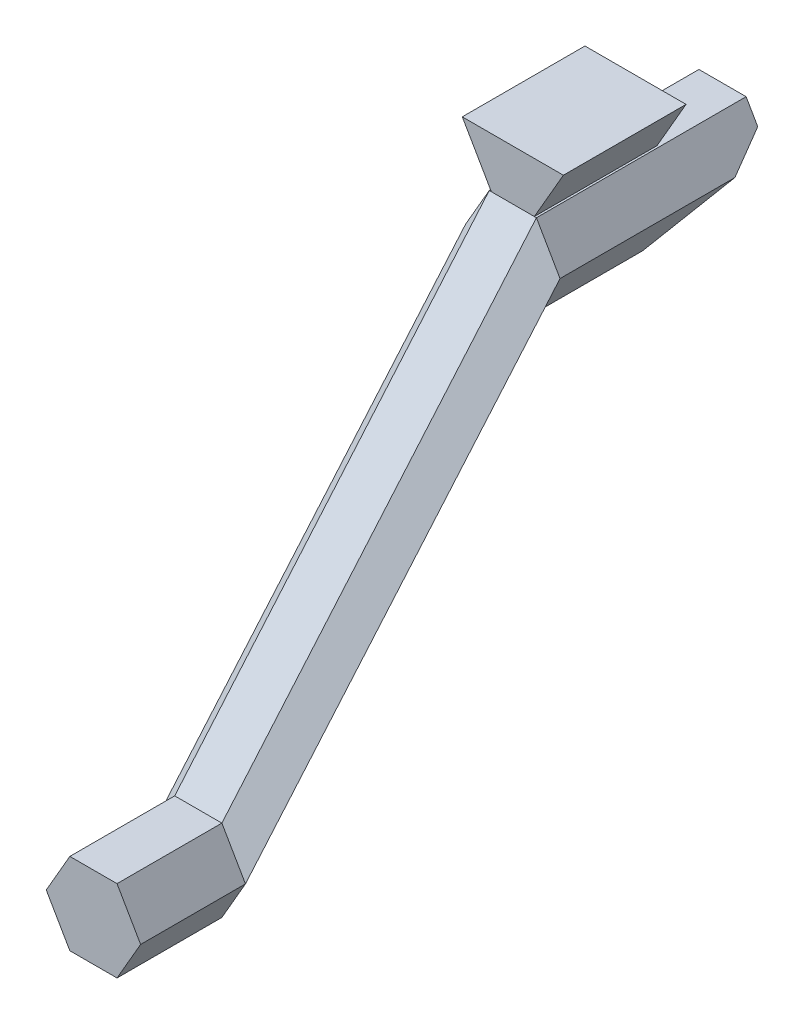
ISO-10303-21;
HEADER;
FILE_DESCRIPTION(('STEP AP214'),'2;1');
FILE_NAME('part.step','',(''),(''),'','','');
FILE_SCHEMA(('AUTOMOTIVE_DESIGN { 1 0 10303 214 1 1 1 1 }'));
ENDSEC;
DATA;
#1=APPLICATION_CONTEXT('core data for automotive mechanical design processes');
#2=APPLICATION_PROTOCOL_DEFINITION('international standard','automotive_design',2000,#1);
#3=PRODUCT_CONTEXT('',#1,'mechanical');
#4=PRODUCT('Part','Part','',(#3));
#5=PRODUCT_RELATED_PRODUCT_CATEGORY('part','',(#4));
#6=PRODUCT_DEFINITION_FORMATION('','',#4);
#7=PRODUCT_DEFINITION_CONTEXT('part definition',#1,'design');
#8=PRODUCT_DEFINITION('design','',#6,#7);
#9=PRODUCT_DEFINITION_SHAPE('','',#8);
#10=(LENGTH_UNIT() NAMED_UNIT(*) SI_UNIT(.MILLI.,.METRE.));
#11=(NAMED_UNIT(*) PLANE_ANGLE_UNIT() SI_UNIT($,.RADIAN.));
#12=(NAMED_UNIT(*) SI_UNIT($,.STERADIAN.) SOLID_ANGLE_UNIT());
#13=UNCERTAINTY_MEASURE_WITH_UNIT(LENGTH_MEASURE(1.E-05),#10,'distance_accuracy_value','');
#14=(GEOMETRIC_REPRESENTATION_CONTEXT(3) GLOBAL_UNCERTAINTY_ASSIGNED_CONTEXT((#13)) GLOBAL_UNIT_ASSIGNED_CONTEXT((#10,
#11,#12)) REPRESENTATION_CONTEXT('',''));
#15=CARTESIAN_POINT('',(0.,0.,0.));
#16=DIRECTION('',(0.,0.,1.));
#17=DIRECTION('',(1.,0.,0.));
#18=AXIS2_PLACEMENT_3D('',#15,#16,#17);
#19=CARTESIAN_POINT('',(2.85750000000006,-4.94933518262803,25.4));
#20=DIRECTION('',(-0.866025403784442,0.499999999999995,0.));
#21=DIRECTION('',(-0.499999999999995,-0.866025403784442,0.));
#22=AXIS2_PLACEMENT_3D('',#19,#20,#21);
#23=PLANE('',#22);
#24=DIRECTION('',(0.,0.,-1.));
#25=VECTOR('',#24,1.);
#26=CARTESIAN_POINT('',(2.85750000000006,-4.94933518262803,25.4));
#27=LINE('',#26,#25);
#28=CARTESIAN_POINT('',(2.85750000000002,-4.94933518262805,25.4));
#29=VERTEX_POINT('',#28);
#30=CARTESIAN_POINT('',(2.85750000000006,-4.94933518262803,12.5400000000001));
#31=VERTEX_POINT('',#30);
#32=EDGE_CURVE('E427',#29,#31,#27,.T.);
#33=ORIENTED_EDGE('',*,*,#32,.T.);
#34=DIRECTION('',(-0.283104064772028,-0.490350624014429,0.824262309000124));
#35=VECTOR('',#34,1.);
#36=CARTESIAN_POINT('',(2.39945468583216,-5.74269293893569,13.8736067378148));
#37=LINE('',#36,#35);
#38=CARTESIAN_POINT('',(5.715,0.,4.22034005493904));
#39=VERTEX_POINT('',#38);
#40=EDGE_CURVE('E338',#31,#39,#37,.F.);
#41=ORIENTED_EDGE('',*,*,#40,.T.);
#42=DIRECTION('',(0.,0.,-1.));
#43=VECTOR('',#42,1.);
#44=CARTESIAN_POINT('',(5.715,0.,25.4));
#45=LINE('',#44,#43);
#46=CARTESIAN_POINT('',(5.71499999999998,0.,25.4));
#47=VERTEX_POINT('',#46);
#48=EDGE_CURVE('E339',#47,#39,#45,.T.);
#49=ORIENTED_EDGE('',*,*,#48,.F.);
#50=DIRECTION('',(0.500000000000003,0.866025403784437,0.));
#51=VECTOR('',#50,1.);
#52=CARTESIAN_POINT('',(2.85750000000002,-4.94933518262801,25.4));
#53=LINE('',#52,#51);
#54=EDGE_CURVE('E434',#29,#47,#53,.T.);
#55=ORIENTED_EDGE('',*,*,#54,.F.);
#56=EDGE_LOOP('',(#33,#41,#49,#55));
#57=FACE_BOUND('',#56,.T.);
#58=ADVANCED_FACE('F48',(#57),#23,.F.);
#59=CARTESIAN_POINT('',(5.715,0.,25.4));
#60=DIRECTION('',(-0.866025403784438,-0.500000000000001,0.));
#61=DIRECTION('',(0.500000000000001,-0.866025403784438,0.));
#62=AXIS2_PLACEMENT_3D('',#59,#60,#61);
#63=PLANE('',#62);
#64=ORIENTED_EDGE('',*,*,#48,.T.);
#65=DIRECTION('',(0.28310406477203,-0.490350624014424,0.824262309000126));
#66=VECTOR('',#65,1.);
#67=CARTESIAN_POINT('',(7.65640937166418,-3.36261967001273,9.87278652437067));
#68=LINE('',#67,#66);
#69=CARTESIAN_POINT('',(4.26546699184535,2.51066481737201,0.));
#70=VERTEX_POINT('',#69);
#71=EDGE_CURVE('E341',#39,#70,#68,.F.);
#72=ORIENTED_EDGE('',*,*,#71,.T.);
#73=DIRECTION('',(-0.500000000000001,0.866025403784438,0.));
#74=VECTOR('',#73,1.);
#75=CARTESIAN_POINT('',(5.715,0.,0.));
#76=LINE('',#75,#74);
#77=CARTESIAN_POINT('',(2.85749999999999,4.94933518262807,0.));
#78=VERTEX_POINT('',#77);
#79=EDGE_CURVE('E311',#70,#78,#76,.T.);
#80=ORIENTED_EDGE('',*,*,#79,.T.);
#81=DIRECTION('',(0.,0.,-1.));
#82=VECTOR('',#81,1.);
#83=CARTESIAN_POINT('',(2.85749999999999,4.94933518262807,25.4));
#84=LINE('',#83,#82);
#85=CARTESIAN_POINT('',(2.85749999999999,4.94933518262807,25.4));
#86=VERTEX_POINT('',#85);
#87=EDGE_CURVE('E425',#86,#78,#84,.T.);
#88=ORIENTED_EDGE('',*,*,#87,.F.);
#89=DIRECTION('',(-0.499999999999991,0.866025403784444,0.));
#90=VECTOR('',#89,1.);
#91=CARTESIAN_POINT('',(5.71499999999994,0.,25.4));
#92=LINE('',#91,#90);
#93=EDGE_CURVE('E437',#47,#86,#92,.T.);
#94=ORIENTED_EDGE('',*,*,#93,.F.);
#95=EDGE_LOOP('',(#64,#72,#80,#88,#94));
#96=FACE_BOUND('',#95,.T.);
#97=ADVANCED_FACE('F383',(#96),#63,.F.);
#98=CARTESIAN_POINT('',(-2.85750000000002,4.94933518262805,25.4));
#99=DIRECTION('',(0.866025403784441,-0.499999999999995,0.));
#100=DIRECTION('',(0.499999999999995,0.866025403784441,0.));
#101=AXIS2_PLACEMENT_3D('',#98,#99,#100);
#102=PLANE('',#101);
#103=DIRECTION('',(-0.499999999999995,-0.866025403784441,0.));
#104=VECTOR('',#103,1.);
#105=CARTESIAN_POINT('',(-2.85750000000002,4.94933518262805,0.));
#106=LINE('',#105,#104);
#107=CARTESIAN_POINT('',(-2.85750000000002,4.94933518262805,0.));
#108=VERTEX_POINT('',#107);
#109=CARTESIAN_POINT('',(-4.2654669918454,2.51066481737192,0.));
#110=VERTEX_POINT('',#109);
#111=EDGE_CURVE('E415',#108,#110,#106,.T.);
#112=ORIENTED_EDGE('',*,*,#111,.T.);
#113=DIRECTION('',(0.283104064772028,0.490350624014429,-0.824262309000124));
#114=VECTOR('',#113,1.);
#115=CARTESIAN_POINT('',(-8.11445468583209,-4.15597742632049,11.2063932621853));
#116=LINE('',#115,#114);
#117=CARTESIAN_POINT('',(-5.715,0.,4.2203400549389));
#118=VERTEX_POINT('',#117);
#119=EDGE_CURVE('E345',#110,#118,#116,.F.);
#120=ORIENTED_EDGE('',*,*,#119,.T.);
#121=DIRECTION('',(0.,0.,-1.));
#122=VECTOR('',#121,1.);
#123=CARTESIAN_POINT('',(-5.715,0.,25.4));
#124=LINE('',#123,#122);
#125=CARTESIAN_POINT('',(-5.715,0.,25.4));
#126=VERTEX_POINT('',#125);
#127=EDGE_CURVE('E412',#126,#118,#124,.T.);
#128=ORIENTED_EDGE('',*,*,#127,.F.);
#129=DIRECTION('',(-0.499999999999995,-0.866025403784441,0.));
#130=VECTOR('',#129,1.);
#131=CARTESIAN_POINT('',(-2.85750000000002,4.94933518262805,25.4));
#132=LINE('',#131,#130);
#133=CARTESIAN_POINT('',(-2.85750000000002,4.94933518262805,25.4));
#134=VERTEX_POINT('',#133);
#135=EDGE_CURVE('E442',#134,#126,#132,.T.);
#136=ORIENTED_EDGE('',*,*,#135,.F.);
#137=DIRECTION('',(0.,0.,-1.));
#138=VECTOR('',#137,1.);
#139=CARTESIAN_POINT('',(-2.85750000000002,4.94933518262805,25.4));
#140=LINE('',#139,#138);
#141=EDGE_CURVE('E422',#134,#108,#140,.T.);
#142=ORIENTED_EDGE('',*,*,#141,.T.);
#143=EDGE_LOOP('',(#112,#120,#128,#136,#142));
#144=FACE_BOUND('',#143,.T.);
#145=ADVANCED_FACE('F389',(#144),#102,.F.);
#146=CARTESIAN_POINT('',(-5.715,0.,25.4));
#147=DIRECTION('',(0.866025403784434,0.500000000000007,0.));
#148=DIRECTION('',(-0.500000000000007,0.866025403784435,0.));
#149=AXIS2_PLACEMENT_3D('',#146,#147,#148);
#150=PLANE('',#149);
#151=ORIENTED_EDGE('',*,*,#127,.T.);
#152=DIRECTION('',(-0.283104064772034,0.490350624014424,-0.824262309000125));
#153=VECTOR('',#152,1.);
#154=CARTESIAN_POINT('',(-2.85749999999995,-4.94933518262809,12.5400000000001));
#155=LINE('',#154,#153);
#156=CARTESIAN_POINT('',(-2.85749999999995,-4.94933518262809,12.5400000000001));
#157=VERTEX_POINT('',#156);
#158=EDGE_CURVE('E347',#118,#157,#155,.F.);
#159=ORIENTED_EDGE('',*,*,#158,.T.);
#160=DIRECTION('',(0.,0.,-1.));
#161=VECTOR('',#160,1.);
#162=CARTESIAN_POINT('',(-2.85749999999995,-4.94933518262809,25.4));
#163=LINE('',#162,#161);
#164=CARTESIAN_POINT('',(-2.85749999999995,-4.94933518262809,25.4));
#165=VERTEX_POINT('',#164);
#166=EDGE_CURVE('E423',#165,#157,#163,.T.);
#167=ORIENTED_EDGE('',*,*,#166,.F.);
#168=DIRECTION('',(0.500000000000007,-0.866025403784435,0.));
#169=VECTOR('',#168,1.);
#170=CARTESIAN_POINT('',(-5.715,0.,25.4));
#171=LINE('',#170,#169);
#172=EDGE_CURVE('E420',#126,#165,#171,.T.);
#173=ORIENTED_EDGE('',*,*,#172,.F.);
#174=EDGE_LOOP('',(#151,#159,#167,#173));
#175=FACE_BOUND('',#174,.T.);
#176=ADVANCED_FACE('F417',(#175),#150,.F.);
#177=CARTESIAN_POINT('',(-2.85749999999995,-4.94933518262809,25.4));
#178=DIRECTION('',(0.,1.,0.));
#179=DIRECTION('',(-1.,0.,0.));
#180=AXIS2_PLACEMENT_3D('',#177,#178,#179);
#181=PLANE('',#180);
#182=ORIENTED_EDGE('',*,*,#166,.T.);
#183=DIRECTION('',(1.,0.,0.));
#184=VECTOR('',#183,1.);
#185=CARTESIAN_POINT('',(-2.85749999999995,-4.94933518262809,12.5400000000001));
#186=LINE('',#185,#184);
#187=EDGE_CURVE('E335',#157,#31,#186,.T.);
#188=ORIENTED_EDGE('',*,*,#187,.T.);
#189=ORIENTED_EDGE('',*,*,#32,.F.);
#190=DIRECTION('',(1.,0.,0.));
#191=VECTOR('',#190,1.);
#192=CARTESIAN_POINT('',(-1.01546060534387E-13,-4.94933518262808,25.4));
#193=LINE('',#192,#191);
#194=EDGE_CURVE('E438',#165,#29,#193,.T.);
#195=ORIENTED_EDGE('',*,*,#194,.F.);
#196=EDGE_LOOP('',(#182,#188,#189,#195));
#197=FACE_BOUND('',#196,.T.);
#198=ADVANCED_FACE('F514',(#197),#181,.F.);
#199=CARTESIAN_POINT('',(0.,0.,0.));
#200=DIRECTION('',(0.,0.,1.));
#201=DIRECTION('',(1.,0.,0.));
#202=AXIS2_PLACEMENT_3D('',#199,#200,#201);
#203=PLANE('',#202);
#204=ORIENTED_EDGE('',*,*,#111,.F.);
#205=DIRECTION('',(-1.,0.,0.));
#206=VECTOR('',#205,1.);
#207=CARTESIAN_POINT('',(-2.85750000000002,4.94933518262805,0.));
#208=LINE('',#207,#206);
#209=EDGE_CURVE('E214',#78,#108,#208,.T.);
#210=ORIENTED_EDGE('',*,*,#209,.F.);
#211=ORIENTED_EDGE('',*,*,#79,.F.);
#212=DIRECTION('',(-1.,0.,0.));
#213=VECTOR('',#212,1.);
#214=CARTESIAN_POINT('',(0.,2.51066481737196,0.));
#215=LINE('',#214,#213);
#216=EDGE_CURVE('E343',#70,#110,#215,.T.);
#217=ORIENTED_EDGE('',*,*,#216,.T.);
#218=EDGE_LOOP('',(#204,#210,#211,#217));
#219=FACE_BOUND('',#218,.T.);
#220=ADVANCED_FACE('F281',(#219),#203,.F.);
#221=CARTESIAN_POINT('',(-6.37581244308027,3.68107703031502,4.29458986870087));
#222=DIRECTION('',(-0.748054471431039,0.43188945044922,0.503871025524092));
#223=DIRECTION('',(0.558660819127343,0.,0.82939621965136));
#224=AXIS2_PLACEMENT_3D('',#221,#222,#223);
#225=PLANE('',#224);
#226=DIRECTION('',(0.,-0.759256602365298,0.650791373455967));
#227=VECTOR('',#226,1.);
#228=CARTESIAN_POINT('',(5.715,0.,25.4));
#229=LINE('',#228,#227);
#230=CARTESIAN_POINT('',(5.71499999999999,-44.4500000000002,63.5));
#231=VERTEX_POINT('',#230);
#232=EDGE_CURVE('E237',#47,#231,#229,.T.);
#233=ORIENTED_EDGE('',*,*,#232,.T.);
#234=DIRECTION('',(0.500000000000006,0.866025403784435,0.));
#235=VECTOR('',#234,1.);
#236=CARTESIAN_POINT('',(23.5336645991093,-13.5871675913144,63.5));
#237=LINE('',#236,#235);
#238=CARTESIAN_POINT('',(2.85750000000006,-49.399335182628,63.5));
#239=VERTEX_POINT('',#238);
#240=EDGE_CURVE('E263',#239,#231,#237,.T.);
#241=ORIENTED_EDGE('',*,*,#240,.F.);
#242=DIRECTION('',(0.,-0.759256602365297,0.650791373455969));
#243=VECTOR('',#242,1.);
#244=CARTESIAN_POINT('',(2.85750000000006,-4.94933518262803,25.4));
#245=LINE('',#244,#243);
#246=EDGE_CURVE('E234',#29,#239,#245,.T.);
#247=ORIENTED_EDGE('',*,*,#246,.F.);
#248=ORIENTED_EDGE('',*,*,#54,.T.);
#249=EDGE_LOOP('',(#233,#241,#247,#248));
#250=FACE_BOUND('',#249,.T.);
#251=ADVANCED_FACE('F270',(#250),#225,.F.);
#252=CARTESIAN_POINT('',(-1.01546060534387E-13,10.4543992167693,12.1967990862308));
#253=DIRECTION('',(0.,0.650791373455969,0.759256602365297));
#254=DIRECTION('',(0.,-0.759256602365297,0.650791373455969));
#255=AXIS2_PLACEMENT_3D('',#252,#253,#254);
#256=PLANE('',#255);
#257=ORIENTED_EDGE('',*,*,#246,.T.);
#258=DIRECTION('',(1.,0.,0.));
#259=VECTOR('',#258,1.);
#260=CARTESIAN_POINT('',(4.79827465624927E-13,-49.3993351826281,63.5));
#261=LINE('',#260,#259);
#262=CARTESIAN_POINT('',(-2.85749999999995,-49.3993351826281,63.5));
#263=VERTEX_POINT('',#262);
#264=EDGE_CURVE('E230',#263,#239,#261,.T.);
#265=ORIENTED_EDGE('',*,*,#264,.F.);
#266=DIRECTION('',(0.,-0.759256602365297,0.650791373455969));
#267=VECTOR('',#266,1.);
#268=CARTESIAN_POINT('',(-2.85749999999995,-4.94933518262809,25.4));
#269=LINE('',#268,#267);
#270=EDGE_CURVE('E228',#165,#263,#269,.T.);
#271=ORIENTED_EDGE('',*,*,#270,.F.);
#272=ORIENTED_EDGE('',*,*,#194,.T.);
#273=EDGE_LOOP('',(#257,#265,#271,#272));
#274=FACE_BOUND('',#273,.T.);
#275=ADVANCED_FACE('F280',(#274),#256,.F.);
#276=CARTESIAN_POINT('',(12.771874619246,7.37384524947759,8.60281945772386));
#277=DIRECTION('',(-0.748054471431055,-0.431889450449209,-0.503871025524077));
#278=DIRECTION('',(-0.558660819127323,0.,0.829396219651373));
#279=AXIS2_PLACEMENT_3D('',#276,#277,#278);
#280=PLANE('',#279);
#281=DIRECTION('',(0.,-0.759256602365297,0.650791373455969));
#282=VECTOR('',#281,1.);
#283=CARTESIAN_POINT('',(2.85749999999999,4.94933518262807,25.4));
#284=LINE('',#283,#282);
#285=CARTESIAN_POINT('',(2.85749999999998,-39.5006648173719,63.5));
#286=VERTEX_POINT('',#285);
#287=EDGE_CURVE('E236',#86,#286,#284,.T.);
#288=ORIENTED_EDGE('',*,*,#287,.T.);
#289=DIRECTION('',(-0.499999999999988,0.866025403784446,0.));
#290=VECTOR('',#289,1.);
#291=CARTESIAN_POINT('',(-14.9611645991089,-8.63783240868552,63.5));
#292=LINE('',#291,#290);
#293=EDGE_CURVE('E312',#231,#286,#292,.T.);
#294=ORIENTED_EDGE('',*,*,#293,.F.);
#295=ORIENTED_EDGE('',*,*,#232,.F.);
#296=ORIENTED_EDGE('',*,*,#93,.T.);
#297=EDGE_LOOP('',(#288,#294,#295,#296));
#298=FACE_BOUND('',#297,.T.);
#299=ADVANCED_FACE('F288',(#298),#280,.F.);
#300=CARTESIAN_POINT('',(0.,14.6467772538189,17.0879067961221));
#301=DIRECTION('',(0.,-0.650791373455969,-0.759256602365296));
#302=DIRECTION('',(0.,0.759256602365296,-0.650791373455969));
#303=AXIS2_PLACEMENT_3D('',#300,#301,#302);
#304=PLANE('',#303);
#305=DIRECTION('',(0.,-0.759256602365296,0.650791373455969));
#306=VECTOR('',#305,1.);
#307=CARTESIAN_POINT('',(-2.85750000000002,4.94933518262805,25.4));
#308=LINE('',#307,#306);
#309=CARTESIAN_POINT('',(-2.85750000000002,-39.5006648173719,63.5));
#310=VERTEX_POINT('',#309);
#311=EDGE_CURVE('E247',#134,#310,#308,.T.);
#312=ORIENTED_EDGE('',*,*,#311,.T.);
#313=DIRECTION('',(-1.,0.,0.));
#314=VECTOR('',#313,1.);
#315=CARTESIAN_POINT('',(0.,-39.5006648173719,63.5));
#316=LINE('',#315,#314);
#317=EDGE_CURVE('E500',#286,#310,#316,.T.);
#318=ORIENTED_EDGE('',*,*,#317,.F.);
#319=ORIENTED_EDGE('',*,*,#287,.F.);
#320=DIRECTION('',(1.,0.,0.));
#321=VECTOR('',#320,1.);
#322=CARTESIAN_POINT('',(0.,4.94933518262806,25.4));
#323=LINE('',#322,#321);
#324=CARTESIAN_POINT('',(2.60349999999999,4.94933518262807,25.4));
#325=VERTEX_POINT('',#324);
#326=EDGE_CURVE('E444',#86,#325,#323,.F.);
#327=ORIENTED_EDGE('',*,*,#326,.T.);
#328=CARTESIAN_POINT('',(-2.60350000000001,4.94933518262807,25.4));
#329=VERTEX_POINT('',#328);
#330=EDGE_CURVE('E447',#325,#329,#323,.F.);
#331=ORIENTED_EDGE('',*,*,#330,.T.);
#332=DIRECTION('',(-1.,0.,0.));
#333=VECTOR('',#332,1.);
#334=CARTESIAN_POINT('',(-3.88723902423239E-13,4.94933518262828,25.4));
#335=LINE('',#334,#333);
#336=EDGE_CURVE('E194',#329,#134,#335,.T.);
#337=ORIENTED_EDGE('',*,*,#336,.T.);
#338=EDGE_LOOP('',(#312,#318,#319,#327,#331,#337));
#339=FACE_BOUND('',#338,.T.);
#340=ADVANCED_FACE('F583',(#339),#304,.F.);
#341=CARTESIAN_POINT('',(-12.771874619246,7.37384524947774,8.60281945772402));
#342=DIRECTION('',(0.748054471431049,-0.431889450449214,-0.503871025524082));
#343=DIRECTION('',(-0.55866081912733,0.,-0.829396219651368));
#344=AXIS2_PLACEMENT_3D('',#341,#342,#343);
#345=PLANE('',#344);
#346=DIRECTION('',(0.,-0.759256602365296,0.650791373455969));
#347=VECTOR('',#346,1.);
#348=CARTESIAN_POINT('',(-5.715,0.,25.4));
#349=LINE('',#348,#347);
#350=CARTESIAN_POINT('',(-5.71499999999999,-44.45,63.5));
#351=VERTEX_POINT('',#350);
#352=EDGE_CURVE('E231',#126,#351,#349,.T.);
#353=ORIENTED_EDGE('',*,*,#352,.T.);
#354=DIRECTION('',(-0.499999999999995,-0.866025403784442,0.));
#355=VECTOR('',#354,1.);
#356=CARTESIAN_POINT('',(14.961164599109,-8.63783240868577,63.5));
#357=LINE('',#356,#355);
#358=EDGE_CURVE('E492',#310,#351,#357,.T.);
#359=ORIENTED_EDGE('',*,*,#358,.F.);
#360=ORIENTED_EDGE('',*,*,#311,.F.);
#361=ORIENTED_EDGE('',*,*,#135,.T.);
#362=EDGE_LOOP('',(#353,#359,#360,#361));
#363=FACE_BOUND('',#362,.T.);
#364=ADVANCED_FACE('F522',(#363),#345,.F.);
#365=CARTESIAN_POINT('',(6.37581244308026,3.68107703031502,4.29458986870085));
#366=DIRECTION('',(0.748054471431038,0.431889450449221,0.503871025524091));
#367=DIRECTION('',(0.558660819127342,0.,-0.82939621965136));
#368=AXIS2_PLACEMENT_3D('',#365,#366,#367);
#369=PLANE('',#368);
#370=ORIENTED_EDGE('',*,*,#270,.T.);
#371=DIRECTION('',(0.500000000000007,-0.866025403784435,0.));
#372=VECTOR('',#371,1.);
#373=CARTESIAN_POINT('',(-23.5336645991093,-13.5871675913144,63.5));
#374=LINE('',#373,#372);
#375=EDGE_CURVE('E334',#351,#263,#374,.T.);
#376=ORIENTED_EDGE('',*,*,#375,.F.);
#377=ORIENTED_EDGE('',*,*,#352,.F.);
#378=ORIENTED_EDGE('',*,*,#172,.T.);
#379=EDGE_LOOP('',(#370,#376,#377,#378));
#380=FACE_BOUND('',#379,.T.);
#381=ADVANCED_FACE('F518',(#380),#369,.F.);
#382=CARTESIAN_POINT('',(4.79827465624927E-13,-49.3993351826281,76.2));
#383=DIRECTION('',(0.,1.,0.));
#384=DIRECTION('',(-1.,0.,0.));
#385=AXIS2_PLACEMENT_3D('',#382,#383,#384);
#386=PLANE('',#385);
#387=ORIENTED_EDGE('',*,*,#264,.T.);
#388=DIRECTION('',(0.,0.,-1.));
#389=VECTOR('',#388,1.);
#390=CARTESIAN_POINT('',(2.85750000000006,-49.399335182628,76.2));
#391=LINE('',#390,#389);
#392=CARTESIAN_POINT('',(2.85750000000006,-49.399335182628,76.2));
#393=VERTEX_POINT('',#392);
#394=EDGE_CURVE('E242',#393,#239,#391,.T.);
#395=ORIENTED_EDGE('',*,*,#394,.F.);
#396=DIRECTION('',(1.,0.,0.));
#397=VECTOR('',#396,1.);
#398=CARTESIAN_POINT('',(4.79827465624927E-13,-49.3993351826281,76.2));
#399=LINE('',#398,#397);
#400=CARTESIAN_POINT('',(-2.85749999999995,-49.3993351826281,76.2));
#401=VERTEX_POINT('',#400);
#402=EDGE_CURVE('E207',#401,#393,#399,.T.);
#403=ORIENTED_EDGE('',*,*,#402,.F.);
#404=DIRECTION('',(0.,0.,-1.));
#405=VECTOR('',#404,1.);
#406=CARTESIAN_POINT('',(-2.85749999999995,-49.3993351826281,76.2));
#407=LINE('',#406,#405);
#408=EDGE_CURVE('E227',#401,#263,#407,.T.);
#409=ORIENTED_EDGE('',*,*,#408,.T.);
#410=EDGE_LOOP('',(#387,#395,#403,#409));
#411=FACE_BOUND('',#410,.T.);
#412=ADVANCED_FACE('F282',(#411),#386,.F.);
#413=CARTESIAN_POINT('',(23.5336645991093,-13.5871675913144,76.2));
#414=DIRECTION('',(-0.866025403784435,0.500000000000006,0.));
#415=DIRECTION('',(-0.500000000000006,-0.866025403784435,0.));
#416=AXIS2_PLACEMENT_3D('',#413,#414,#415);
#417=PLANE('',#416);
#418=ORIENTED_EDGE('',*,*,#240,.T.);
#419=DIRECTION('',(0.,0.,-1.));
#420=VECTOR('',#419,1.);
#421=CARTESIAN_POINT('',(5.71499999999999,-44.4500000000002,76.2));
#422=LINE('',#421,#420);
#423=CARTESIAN_POINT('',(5.71499999999999,-44.4500000000002,76.2));
#424=VERTEX_POINT('',#423);
#425=EDGE_CURVE('E317',#424,#231,#422,.T.);
#426=ORIENTED_EDGE('',*,*,#425,.F.);
#427=DIRECTION('',(0.500000000000006,0.866025403784435,0.));
#428=VECTOR('',#427,1.);
#429=CARTESIAN_POINT('',(23.5336645991093,-13.5871675913144,76.2));
#430=LINE('',#429,#428);
#431=EDGE_CURVE('E211',#393,#424,#430,.T.);
#432=ORIENTED_EDGE('',*,*,#431,.F.);
#433=ORIENTED_EDGE('',*,*,#394,.T.);
#434=EDGE_LOOP('',(#418,#426,#432,#433));
#435=FACE_BOUND('',#434,.T.);
#436=ADVANCED_FACE('F559',(#435),#417,.F.);
#437=CARTESIAN_POINT('',(-14.9611645991089,-8.63783240868552,76.2));
#438=DIRECTION('',(-0.866025403784446,-0.499999999999988,0.));
#439=DIRECTION('',(0.499999999999988,-0.866025403784446,0.));
#440=AXIS2_PLACEMENT_3D('',#437,#438,#439);
#441=PLANE('',#440);
#442=ORIENTED_EDGE('',*,*,#293,.T.);
#443=DIRECTION('',(0.,0.,-1.));
#444=VECTOR('',#443,1.);
#445=CARTESIAN_POINT('',(2.85749999999998,-39.5006648173719,76.2));
#446=LINE('',#445,#444);
#447=CARTESIAN_POINT('',(2.85749999999998,-39.5006648173719,76.2));
#448=VERTEX_POINT('',#447);
#449=EDGE_CURVE('E530',#448,#286,#446,.T.);
#450=ORIENTED_EDGE('',*,*,#449,.F.);
#451=DIRECTION('',(-0.499999999999988,0.866025403784446,0.));
#452=VECTOR('',#451,1.);
#453=CARTESIAN_POINT('',(-14.9611645991089,-8.63783240868552,76.2));
#454=LINE('',#453,#452);
#455=EDGE_CURVE('E219',#424,#448,#454,.T.);
#456=ORIENTED_EDGE('',*,*,#455,.F.);
#457=ORIENTED_EDGE('',*,*,#425,.T.);
#458=EDGE_LOOP('',(#442,#450,#456,#457));
#459=FACE_BOUND('',#458,.T.);
#460=ADVANCED_FACE('F551',(#459),#441,.F.);
#461=CARTESIAN_POINT('',(0.,-39.5006648173719,76.2));
#462=DIRECTION('',(0.,-1.,0.));
#463=DIRECTION('',(1.,0.,0.));
#464=AXIS2_PLACEMENT_3D('',#461,#462,#463);
#465=PLANE('',#464);
#466=ORIENTED_EDGE('',*,*,#317,.T.);
#467=DIRECTION('',(0.,0.,-1.));
#468=VECTOR('',#467,1.);
#469=CARTESIAN_POINT('',(-2.85750000000002,-39.5006648173719,76.2));
#470=LINE('',#469,#468);
#471=CARTESIAN_POINT('',(-2.85750000000002,-39.5006648173719,76.2));
#472=VERTEX_POINT('',#471);
#473=EDGE_CURVE('E501',#472,#310,#470,.T.);
#474=ORIENTED_EDGE('',*,*,#473,.F.);
#475=DIRECTION('',(-1.,0.,0.));
#476=VECTOR('',#475,1.);
#477=CARTESIAN_POINT('',(0.,-39.5006648173719,76.2));
#478=LINE('',#477,#476);
#479=EDGE_CURVE('E221',#448,#472,#478,.T.);
#480=ORIENTED_EDGE('',*,*,#479,.F.);
#481=ORIENTED_EDGE('',*,*,#449,.T.);
#482=EDGE_LOOP('',(#466,#474,#480,#481));
#483=FACE_BOUND('',#482,.T.);
#484=ADVANCED_FACE('F481',(#483),#465,.F.);
#485=CARTESIAN_POINT('',(14.961164599109,-8.63783240868577,76.2));
#486=DIRECTION('',(0.866025403784441,-0.499999999999995,0.));
#487=DIRECTION('',(0.499999999999995,0.866025403784442,0.));
#488=AXIS2_PLACEMENT_3D('',#485,#486,#487);
#489=PLANE('',#488);
#490=ORIENTED_EDGE('',*,*,#358,.T.);
#491=DIRECTION('',(0.,0.,-1.));
#492=VECTOR('',#491,1.);
#493=CARTESIAN_POINT('',(-5.71499999999999,-44.45,76.2));
#494=LINE('',#493,#492);
#495=CARTESIAN_POINT('',(-5.71499999999999,-44.45,76.2));
#496=VERTEX_POINT('',#495);
#497=EDGE_CURVE('E451',#496,#351,#494,.T.);
#498=ORIENTED_EDGE('',*,*,#497,.F.);
#499=DIRECTION('',(-0.499999999999995,-0.866025403784442,0.));
#500=VECTOR('',#499,1.);
#501=CARTESIAN_POINT('',(14.961164599109,-8.63783240868577,76.2));
#502=LINE('',#501,#500);
#503=EDGE_CURVE('E223',#472,#496,#502,.T.);
#504=ORIENTED_EDGE('',*,*,#503,.F.);
#505=ORIENTED_EDGE('',*,*,#473,.T.);
#506=EDGE_LOOP('',(#490,#498,#504,#505));
#507=FACE_BOUND('',#506,.T.);
#508=ADVANCED_FACE('F476',(#507),#489,.F.);
#509=CARTESIAN_POINT('',(-23.5336645991093,-13.5871675913144,76.2));
#510=DIRECTION('',(0.866025403784435,0.500000000000007,0.));
#511=DIRECTION('',(-0.500000000000007,0.866025403784435,0.));
#512=AXIS2_PLACEMENT_3D('',#509,#510,#511);
#513=PLANE('',#512);
#514=ORIENTED_EDGE('',*,*,#375,.T.);
#515=ORIENTED_EDGE('',*,*,#408,.F.);
#516=DIRECTION('',(0.500000000000007,-0.866025403784435,0.));
#517=VECTOR('',#516,1.);
#518=CARTESIAN_POINT('',(-23.5336645991093,-13.5871675913144,76.2));
#519=LINE('',#518,#517);
#520=EDGE_CURVE('E225',#496,#401,#519,.T.);
#521=ORIENTED_EDGE('',*,*,#520,.F.);
#522=ORIENTED_EDGE('',*,*,#497,.T.);
#523=EDGE_LOOP('',(#514,#515,#521,#522));
#524=FACE_BOUND('',#523,.T.);
#525=ADVANCED_FACE('F465',(#524),#513,.F.);
#526=CARTESIAN_POINT('',(0.,0.,76.2));
#527=DIRECTION('',(0.,0.,1.));
#528=DIRECTION('',(1.,0.,0.));
#529=AXIS2_PLACEMENT_3D('',#526,#527,#528);
#530=PLANE('',#529);
#531=ORIENTED_EDGE('',*,*,#402,.T.);
#532=ORIENTED_EDGE('',*,*,#431,.T.);
#533=ORIENTED_EDGE('',*,*,#455,.T.);
#534=ORIENTED_EDGE('',*,*,#479,.T.);
#535=ORIENTED_EDGE('',*,*,#503,.T.);
#536=ORIENTED_EDGE('',*,*,#520,.T.);
#537=EDGE_LOOP('',(#531,#532,#533,#534,#535,#536));
#538=FACE_BOUND('',#537,.T.);
#539=ADVANCED_FACE('F475',(#538),#530,.T.);
#540=CARTESIAN_POINT('',(-6.37702724097996,11.0453351826281,25.4));
#541=DIRECTION('',(0.,1.,0.));
#542=DIRECTION('',(-1.,0.,0.));
#543=AXIS2_PLACEMENT_3D('',#540,#541,#542);
#544=PLANE('',#543);
#545=DIRECTION('',(0.,0.,-1.));
#546=VECTOR('',#545,1.);
#547=CARTESIAN_POINT('',(6.12302724097995,11.0453351826281,76.200025));
#548=LINE('',#547,#546);
#549=CARTESIAN_POINT('',(6.12302724097995,11.0453351826281,25.4));
#550=VERTEX_POINT('',#549);
#551=CARTESIAN_POINT('',(6.12302724097995,11.0453351826281,10.541));
#552=VERTEX_POINT('',#551);
#553=EDGE_CURVE('E195',#550,#552,#548,.T.);
#554=ORIENTED_EDGE('',*,*,#553,.T.);
#555=DIRECTION('',(-1.,0.,0.));
#556=VECTOR('',#555,1.);
#557=CARTESIAN_POINT('',(-6.1230272409793,11.0453351826281,10.541));
#558=LINE('',#557,#556);
#559=CARTESIAN_POINT('',(-6.1230272409793,11.0453351826281,10.541));
#560=VERTEX_POINT('',#559);
#561=EDGE_CURVE('E202',#552,#560,#558,.T.);
#562=ORIENTED_EDGE('',*,*,#561,.T.);
#563=DIRECTION('',(0.,0.,-1.));
#564=VECTOR('',#563,1.);
#565=CARTESIAN_POINT('',(-6.1230272409793,11.0453351826281,76.200025));
#566=LINE('',#565,#564);
#567=CARTESIAN_POINT('',(-6.1230272409793,11.0453351826281,25.4));
#568=VERTEX_POINT('',#567);
#569=EDGE_CURVE('E186',#568,#560,#566,.T.);
#570=ORIENTED_EDGE('',*,*,#569,.F.);
#571=DIRECTION('',(1.,0.,0.));
#572=VECTOR('',#571,1.);
#573=CARTESIAN_POINT('',(-6.37702724097996,11.0453351826281,25.4));
#574=LINE('',#573,#572);
#575=EDGE_CURVE('E200',#568,#550,#574,.T.);
#576=ORIENTED_EDGE('',*,*,#575,.T.);
#577=EDGE_LOOP('',(#554,#562,#570,#576));
#578=FACE_BOUND('',#577,.T.);
#579=ADVANCED_FACE('F199',(#578),#544,.T.);
#580=CARTESIAN_POINT('',(0.,0.,25.4));
#581=DIRECTION('',(0.,0.,-1.));
#582=DIRECTION('',(-1.,0.,0.));
#583=AXIS2_PLACEMENT_3D('',#580,#581,#582);
#584=PLANE('',#583);
#585=ORIENTED_EDGE('',*,*,#330,.F.);
#586=DIRECTION('',(0.500000000000001,0.866025403784438,0.));
#587=VECTOR('',#586,1.);
#588=CARTESIAN_POINT('',(-0.190500000000018,0.109985226280634,25.4));
#589=LINE('',#588,#587);
#590=EDGE_CURVE('E206',#325,#550,#589,.T.);
#591=ORIENTED_EDGE('',*,*,#590,.T.);
#592=ORIENTED_EDGE('',*,*,#575,.F.);
#593=DIRECTION('',(0.49999999999993,-0.866025403784479,0.));
#594=VECTOR('',#593,1.);
#595=CARTESIAN_POINT('',(0.19049999999961,0.109985226280378,25.4));
#596=LINE('',#595,#594);
#597=EDGE_CURVE('E182',#568,#329,#596,.T.);
#598=ORIENTED_EDGE('',*,*,#597,.T.);
#599=EDGE_LOOP('',(#585,#591,#592,#598));
#600=FACE_BOUND('',#599,.T.);
#601=ADVANCED_FACE('F205',(#600),#584,.F.);
#602=CARTESIAN_POINT('',(-2.85749999999995,-4.94933518262809,12.5400000000001));
#603=DIRECTION('',(0.,0.859421950806478,0.511266965950264));
#604=DIRECTION('',(1.,0.,0.));
#605=AXIS2_PLACEMENT_3D('',#602,#603,#604);
#606=PLANE('',#605);
#607=ORIENTED_EDGE('',*,*,#119,.F.);
#608=ORIENTED_EDGE('',*,*,#216,.F.);
#609=ORIENTED_EDGE('',*,*,#71,.F.);
#610=ORIENTED_EDGE('',*,*,#40,.F.);
#611=ORIENTED_EDGE('',*,*,#187,.F.);
#612=ORIENTED_EDGE('',*,*,#158,.F.);
#613=EDGE_LOOP('',(#607,#608,#609,#610,#611,#612));
#614=FACE_BOUND('',#613,.T.);
#615=ADVANCED_FACE('F394',(#614),#606,.F.);
#616=CARTESIAN_POINT('',(-2.85750000000002,4.94933518262805,10.16));
#617=DIRECTION('',(0.,-1.,0.));
#618=DIRECTION('',(1.,0.,0.));
#619=AXIS2_PLACEMENT_3D('',#616,#617,#618);
#620=PLANE('',#619);
#621=ORIENTED_EDGE('',*,*,#209,.T.);
#622=ORIENTED_EDGE('',*,*,#141,.F.);
#623=ORIENTED_EDGE('',*,*,#336,.F.);
#624=DIRECTION('',(0.,0.,-1.));
#625=VECTOR('',#624,1.);
#626=CARTESIAN_POINT('',(-2.60350000000001,4.94933518262807,76.200025));
#627=LINE('',#626,#625);
#628=CARTESIAN_POINT('',(-2.60350000000001,4.94933518262807,10.541));
#629=VERTEX_POINT('',#628);
#630=EDGE_CURVE('E189',#329,#629,#627,.T.);
#631=ORIENTED_EDGE('',*,*,#630,.T.);
#632=DIRECTION('',(-0.755928946018439,0.,0.654653670707995));
#633=VECTOR('',#632,1.);
#634=CARTESIAN_POINT('',(-2.5600967549475,4.94933518262805,10.5034116871779));
#635=LINE('',#634,#633);
#636=CARTESIAN_POINT('',(-2.16355909487752,4.94933518262806,10.16));
#637=VERTEX_POINT('',#636);
#638=EDGE_CURVE('E57',#629,#637,#635,.F.);
#639=ORIENTED_EDGE('',*,*,#638,.T.);
#640=DIRECTION('',(-1.,0.,0.));
#641=VECTOR('',#640,1.);
#642=CARTESIAN_POINT('',(-2.85750000000002,4.94933518262805,10.16));
#643=LINE('',#642,#641);
#644=CARTESIAN_POINT('',(2.16355909487749,4.94933518262807,10.16));
#645=VERTEX_POINT('',#644);
#646=EDGE_CURVE('E208',#645,#637,#643,.T.);
#647=ORIENTED_EDGE('',*,*,#646,.F.);
#648=DIRECTION('',(-0.755928946018454,0.,-0.654653670707978));
#649=VECTOR('',#648,1.);
#650=CARTESIAN_POINT('',(-0.705617530766797,4.94933518262806,7.67522015424753));
#651=LINE('',#650,#649);
#652=CARTESIAN_POINT('',(2.60349999999999,4.94933518262807,10.541));
#653=VERTEX_POINT('',#652);
#654=EDGE_CURVE('E12',#645,#653,#651,.F.);
#655=ORIENTED_EDGE('',*,*,#654,.T.);
#656=DIRECTION('',(0.,0.,-1.));
#657=VECTOR('',#656,1.);
#658=CARTESIAN_POINT('',(2.60349999999999,4.94933518262807,76.200025));
#659=LINE('',#658,#657);
#660=EDGE_CURVE('E595',#325,#653,#659,.T.);
#661=ORIENTED_EDGE('',*,*,#660,.F.);
#662=ORIENTED_EDGE('',*,*,#326,.F.);
#663=ORIENTED_EDGE('',*,*,#87,.T.);
#664=EDGE_LOOP('',(#621,#622,#623,#631,#639,#647,#655,#661,#662,#663));
#665=FACE_BOUND('',#664,.T.);
#666=ADVANCED_FACE('F374',(#665),#620,.F.);
#667=CARTESIAN_POINT('',(0.,0.,10.16));
#668=DIRECTION('',(0.,0.,1.));
#669=DIRECTION('',(1.,0.,0.));
#670=AXIS2_PLACEMENT_3D('',#667,#668,#669);
#671=PLANE('',#670);
#672=ORIENTED_EDGE('',*,*,#646,.T.);
#673=DIRECTION('',(-0.49999999999993,0.866025403784479,0.));
#674=VECTOR('',#673,1.);
#675=CARTESIAN_POINT('',(0.520455678841503,0.300485226280355,10.16));
#676=LINE('',#675,#674);
#677=CARTESIAN_POINT('',(-5.46311588329561,10.664335182628,10.16));
#678=VERTEX_POINT('',#677);
#679=EDGE_CURVE('E355',#637,#678,#676,.T.);
#680=ORIENTED_EDGE('',*,*,#679,.T.);
#681=DIRECTION('',(1.,0.,0.));
#682=VECTOR('',#681,1.);
#683=CARTESIAN_POINT('',(6.12302724097995,10.664335182628,10.16));
#684=LINE('',#683,#682);
#685=CARTESIAN_POINT('',(5.46311588329619,10.664335182628,10.16));
#686=VERTEX_POINT('',#685);
#687=EDGE_CURVE('E351',#678,#686,#684,.T.);
#688=ORIENTED_EDGE('',*,*,#687,.T.);
#689=DIRECTION('',(-0.500000000000001,-0.866025403784438,0.));
#690=VECTOR('',#689,1.);
#691=CARTESIAN_POINT('',(-0.520455678841893,0.300485226280637,10.16));
#692=LINE('',#691,#690);
#693=EDGE_CURVE('E353',#686,#645,#692,.T.);
#694=ORIENTED_EDGE('',*,*,#693,.T.);
#695=EDGE_LOOP('',(#672,#680,#688,#694));
#696=FACE_BOUND('',#695,.T.);
#697=ADVANCED_FACE('F372',(#696),#671,.F.);
#698=CARTESIAN_POINT('',(-6.1230272409793,11.0453351826281,76.200025));
#699=DIRECTION('',(0.866025403784479,0.49999999999993,0.));
#700=DIRECTION('',(-0.49999999999993,0.866025403784479,0.));
#701=AXIS2_PLACEMENT_3D('',#698,#699,#700);
#702=PLANE('',#701);
#703=ORIENTED_EDGE('',*,*,#569,.T.);
#704=DIRECTION('',(0.49999999999993,-0.866025403784479,0.));
#705=VECTOR('',#704,1.);
#706=CARTESIAN_POINT('',(-6.1230272409793,11.0453351826281,10.541));
#707=LINE('',#706,#705);
#708=EDGE_CURVE('E349',#560,#629,#707,.T.);
#709=ORIENTED_EDGE('',*,*,#708,.T.);
#710=ORIENTED_EDGE('',*,*,#630,.F.);
#711=ORIENTED_EDGE('',*,*,#597,.F.);
#712=EDGE_LOOP('',(#703,#709,#710,#711));
#713=FACE_BOUND('',#712,.T.);
#714=ADVANCED_FACE('F184',(#713),#702,.F.);
#715=CARTESIAN_POINT('',(2.60349999999999,4.94933518262807,76.200025));
#716=DIRECTION('',(-0.866025403784438,0.500000000000001,0.));
#717=DIRECTION('',(-0.500000000000001,-0.866025403784438,0.));
#718=AXIS2_PLACEMENT_3D('',#715,#716,#717);
#719=PLANE('',#718);
#720=ORIENTED_EDGE('',*,*,#660,.T.);
#721=DIRECTION('',(0.500000000000001,0.866025403784438,0.));
#722=VECTOR('',#721,1.);
#723=CARTESIAN_POINT('',(2.60349999999999,4.94933518262807,10.541));
#724=LINE('',#723,#722);
#725=EDGE_CURVE('E65',#653,#552,#724,.T.);
#726=ORIENTED_EDGE('',*,*,#725,.T.);
#727=ORIENTED_EDGE('',*,*,#553,.F.);
#728=ORIENTED_EDGE('',*,*,#590,.F.);
#729=EDGE_LOOP('',(#720,#726,#727,#728));
#730=FACE_BOUND('',#729,.T.);
#731=ADVANCED_FACE('F597',(#730),#719,.F.);
#732=CARTESIAN_POINT('',(2.60349999999999,4.94933518262807,10.541));
#733=DIRECTION('',(-0.612372435695796,0.353553390593276,0.707106781186546));
#734=DIRECTION('',(0.500000000000001,0.866025403784438,0.));
#735=AXIS2_PLACEMENT_3D('',#732,#733,#734);
#736=PLANE('',#735);
#737=ORIENTED_EDGE('',*,*,#654,.F.);
#738=ORIENTED_EDGE('',*,*,#693,.F.);
#739=DIRECTION('',(0.774596669241483,0.447213595499959,0.447213595499958));
#740=VECTOR('',#739,1.);
#741=CARTESIAN_POINT('',(2.18524635331848,8.77185632712693,8.2675211444989));
#742=LINE('',#741,#740);
#743=EDGE_CURVE('E52',#552,#686,#742,.F.);
#744=ORIENTED_EDGE('',*,*,#743,.F.);
#745=ORIENTED_EDGE('',*,*,#725,.F.);
#746=EDGE_LOOP('',(#737,#738,#744,#745));
#747=FACE_BOUND('',#746,.T.);
#748=ADVANCED_FACE('F50',(#747),#736,.F.);
#749=CARTESIAN_POINT('',(0.,10.664335182628,10.16));
#750=DIRECTION('',(0.,0.707106781186547,-0.707106781186548));
#751=DIRECTION('',(-1.,0.,0.));
#752=AXIS2_PLACEMENT_3D('',#749,#750,#751);
#753=PLANE('',#752);
#754=ORIENTED_EDGE('',*,*,#743,.T.);
#755=ORIENTED_EDGE('',*,*,#687,.F.);
#756=DIRECTION('',(0.774596669241454,-0.447213595499984,-0.447213595499983));
#757=VECTOR('',#756,1.);
#758=CARTESIAN_POINT('',(-2.18524635331849,8.7718563271271,8.26752114449906));
#759=LINE('',#758,#757);
#760=EDGE_CURVE('E359',#560,#678,#759,.T.);
#761=ORIENTED_EDGE('',*,*,#760,.F.);
#762=ORIENTED_EDGE('',*,*,#561,.F.);
#763=EDGE_LOOP('',(#754,#755,#761,#762));
#764=FACE_BOUND('',#763,.T.);
#765=ADVANCED_FACE('F368',(#764),#753,.T.);
#766=CARTESIAN_POINT('',(-6.1230272409793,11.0453351826281,10.541));
#767=DIRECTION('',(0.612372435695823,0.353553390593224,0.707106781186548));
#768=DIRECTION('',(0.49999999999993,-0.866025403784479,0.));
#769=AXIS2_PLACEMENT_3D('',#766,#767,#768);
#770=PLANE('',#769);
#771=ORIENTED_EDGE('',*,*,#760,.T.);
#772=ORIENTED_EDGE('',*,*,#679,.F.);
#773=ORIENTED_EDGE('',*,*,#638,.F.);
#774=ORIENTED_EDGE('',*,*,#708,.F.);
#775=EDGE_LOOP('',(#771,#772,#773,#774));
#776=FACE_BOUND('',#775,.T.);
#777=ADVANCED_FACE('F375',(#776),#770,.F.);
#778=CLOSED_SHELL('',(#58,#97,#145,#176,#198,#220,#251,#275,#299,#340,#364,#381,#412,#436,#460,
#484,#508,#525,#539,#579,#601,#615,#666,#697,#714,#731,#748,#765,#777));
#779=MANIFOLD_SOLID_BREP('B2',#778);
#780=ADVANCED_BREP_SHAPE_REPRESENTATION('',(#18,#779),#14);
#781=SHAPE_DEFINITION_REPRESENTATION(#9,#780);
ENDSEC;
END-ISO-10303-21;
